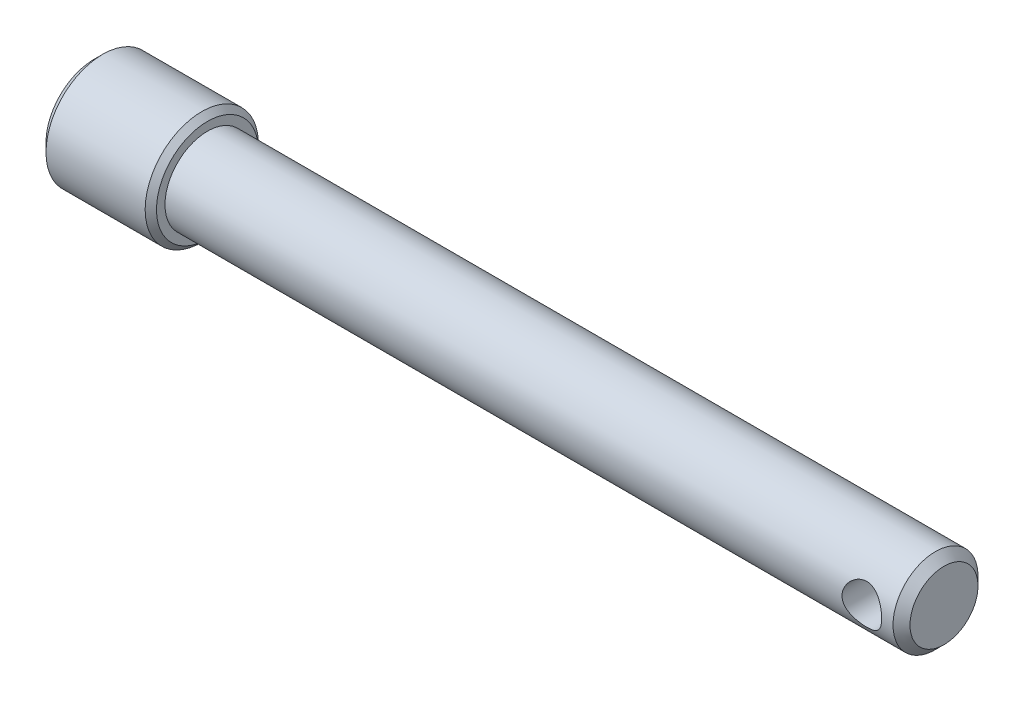
ISO-10303-21;
HEADER;
FILE_DESCRIPTION(('STEP AP214'),'2;1');
FILE_NAME('part.step','',(''),(''),'','','');
FILE_SCHEMA(('AUTOMOTIVE_DESIGN { 1 0 10303 214 1 1 1 1 }'));
ENDSEC;
DATA;
#1=APPLICATION_CONTEXT('core data for automotive mechanical design processes');
#2=APPLICATION_PROTOCOL_DEFINITION('international standard','automotive_design',2000,#1);
#3=PRODUCT_CONTEXT('',#1,'mechanical');
#4=PRODUCT('Part','Part','',(#3));
#5=PRODUCT_RELATED_PRODUCT_CATEGORY('part','',(#4));
#6=PRODUCT_DEFINITION_FORMATION('','',#4);
#7=PRODUCT_DEFINITION_CONTEXT('part definition',#1,'design');
#8=PRODUCT_DEFINITION('design','',#6,#7);
#9=PRODUCT_DEFINITION_SHAPE('','',#8);
#10=(LENGTH_UNIT() NAMED_UNIT(*) SI_UNIT(.MILLI.,.METRE.));
#11=(NAMED_UNIT(*) PLANE_ANGLE_UNIT() SI_UNIT($,.RADIAN.));
#12=(NAMED_UNIT(*) SI_UNIT($,.STERADIAN.) SOLID_ANGLE_UNIT());
#13=UNCERTAINTY_MEASURE_WITH_UNIT(LENGTH_MEASURE(1.E-05),#10,'distance_accuracy_value','');
#14=(GEOMETRIC_REPRESENTATION_CONTEXT(3) GLOBAL_UNCERTAINTY_ASSIGNED_CONTEXT((#13)) GLOBAL_UNIT_ASSIGNED_CONTEXT((#10,
#11,#12)) REPRESENTATION_CONTEXT('',''));
#15=CARTESIAN_POINT('',(0.,0.,0.));
#16=DIRECTION('',(0.,0.,1.));
#17=DIRECTION('',(1.,0.,0.));
#18=AXIS2_PLACEMENT_3D('',#15,#16,#17);
#19=CARTESIAN_POINT('',(0.,0.,0.));
#20=DIRECTION('',(1.,0.,0.));
#21=DIRECTION('',(0.,0.,-1.));
#22=AXIS2_PLACEMENT_3D('',#19,#20,#21);
#23=PLANE('',#22);
#24=CARTESIAN_POINT('',(0.,0.,0.));
#25=DIRECTION('',(1.,0.,0.));
#26=DIRECTION('',(0.,0.,-1.));
#27=AXIS2_PLACEMENT_3D('',#24,#25,#26);
#28=CIRCLE('',#27,17.);
#29=CARTESIAN_POINT('',(0.,0.,-17.));
#30=VERTEX_POINT('',#29);
#31=EDGE_CURVE('E108',#30,#30,#28,.F.);
#32=ORIENTED_EDGE('',*,*,#31,.T.);
#33=EDGE_LOOP('',(#32));
#34=FACE_BOUND('',#33,.T.);
#35=ADVANCED_FACE('F36',(#34),#23,.F.);
#36=CARTESIAN_POINT('',(0.,0.,0.));
#37=DIRECTION('',(-1.,0.,0.));
#38=DIRECTION('',(0.,0.,1.));
#39=AXIS2_PLACEMENT_3D('',#36,#37,#38);
#40=CYLINDRICAL_SURFACE('',#39,20.);
#41=CARTESIAN_POINT('',(38.0000000000001,0.,0.));
#42=DIRECTION('',(-1.,0.,0.));
#43=DIRECTION('',(0.,0.,1.));
#44=AXIS2_PLACEMENT_3D('',#41,#42,#43);
#45=CIRCLE('',#44,20.);
#46=CARTESIAN_POINT('',(38.0000000000001,0.,20.));
#47=VERTEX_POINT('',#46);
#48=EDGE_CURVE('E43',#47,#47,#45,.T.);
#49=ORIENTED_EDGE('',*,*,#48,.T.);
#50=EDGE_LOOP('',(#49));
#51=FACE_BOUND('',#50,.T.);
#52=CARTESIAN_POINT('',(2.99999999999997,0.,0.));
#53=DIRECTION('',(1.,0.,0.));
#54=DIRECTION('',(0.,0.,-1.));
#55=AXIS2_PLACEMENT_3D('',#52,#53,#54);
#56=CIRCLE('',#55,20.);
#57=CARTESIAN_POINT('',(2.99999999999997,0.,-20.));
#58=VERTEX_POINT('',#57);
#59=EDGE_CURVE('E105',#58,#58,#56,.T.);
#60=ORIENTED_EDGE('',*,*,#59,.T.);
#61=EDGE_LOOP('',(#60));
#62=FACE_BOUND('',#61,.T.);
#63=ADVANCED_FACE('F88',(#51,#62),#40,.T.);
#64=CARTESIAN_POINT('',(40.,20.,0.));
#65=DIRECTION('',(-1.,0.,0.));
#66=DIRECTION('',(0.,0.,1.));
#67=AXIS2_PLACEMENT_3D('',#64,#65,#66);
#68=PLANE('',#67);
#69=CARTESIAN_POINT('',(40.,0.,0.));
#70=DIRECTION('',(-1.,0.,0.));
#71=DIRECTION('',(0.,0.,1.));
#72=AXIS2_PLACEMENT_3D('',#69,#70,#71);
#73=CIRCLE('',#72,18.);
#74=CARTESIAN_POINT('',(40.,0.,18.));
#75=VERTEX_POINT('',#74);
#76=EDGE_CURVE('E10',#75,#75,#73,.F.);
#77=ORIENTED_EDGE('',*,*,#76,.T.);
#78=EDGE_LOOP('',(#77));
#79=FACE_BOUND('',#78,.T.);
#80=CARTESIAN_POINT('',(40.,0.,0.));
#81=DIRECTION('',(-1.,0.,0.));
#82=DIRECTION('',(0.,0.,1.));
#83=AXIS2_PLACEMENT_3D('',#80,#81,#82);
#84=CIRCLE('',#83,15.);
#85=CARTESIAN_POINT('',(40.,0.,15.));
#86=VERTEX_POINT('',#85);
#87=EDGE_CURVE('E61',#86,#86,#84,.T.);
#88=ORIENTED_EDGE('',*,*,#87,.T.);
#89=EDGE_LOOP('',(#88));
#90=FACE_BOUND('',#89,.T.);
#91=ADVANCED_FACE('F85',(#79,#90),#68,.F.);
#92=CARTESIAN_POINT('',(0.,0.,0.));
#93=DIRECTION('',(-1.,0.,0.));
#94=DIRECTION('',(0.,0.,1.));
#95=AXIS2_PLACEMENT_3D('',#92,#93,#94);
#96=CYLINDRICAL_SURFACE('',#95,15.);
#97=CARTESIAN_POINT('',(293.,0.,15.));
#98=CARTESIAN_POINT('',(292.999998731185,-0.185527509645677,14.9999989062768));
#99=CARTESIAN_POINT('',(292.992614949632,-0.371089159565341,14.9965492462378));
#100=CARTESIAN_POINT('',(292.963156568287,-0.740864688822055,14.9828363155982));
#101=CARTESIAN_POINT('',(292.941074344481,-0.925077818529062,14.9725695089819));
#102=CARTESIAN_POINT('',(292.882417576453,-1.29101586500657,14.9454673410377));
#103=CARTESIAN_POINT('',(292.845818323161,-1.47273599005481,14.928620781231));
#104=CARTESIAN_POINT('',(292.758512241694,-1.8321376673413,14.8887870557922));
#105=CARTESIAN_POINT('',(292.707799641303,-2.00981753492442,14.8657973778409));
#106=CARTESIAN_POINT('',(292.59302911612,-2.35915888310923,14.8143651145563));
#107=CARTESIAN_POINT('',(292.529027504386,-2.5308422985917,14.7859455779182));
#108=CARTESIAN_POINT('',(292.388115461742,-2.86799253886093,14.7242659158823));
#109=CARTESIAN_POINT('',(292.311200122247,-3.03345697039452,14.6910039504898));
#110=CARTESIAN_POINT('',(292.145151291426,-3.35710712682748,14.6204390462863));
#111=CARTESIAN_POINT('',(292.056025326136,-3.51529725565324,14.5831385995459));
#112=CARTESIAN_POINT('',(291.866159767541,-3.82374236929165,14.5053212671914));
#113=CARTESIAN_POINT('',(291.765415936483,-3.97399442927472,14.4648032096043));
#114=CARTESIAN_POINT('',(291.435167023589,-4.42760170939732,14.3352174768163));
#115=CARTESIAN_POINT('',(291.186620820033,-4.71623752299433,14.2420761526874));
#116=CARTESIAN_POINT('',(290.646248995409,-5.24943713176361,14.0543075209071));
#117=CARTESIAN_POINT('',(290.354395109371,-5.49397191152755,13.9596792791476));
#118=CARTESIAN_POINT('',(289.878587977755,-5.83075411050437,13.8209401738483));
#119=CARTESIAN_POINT('',(289.707857928231,-5.94080662569289,13.7738664925622));
#120=CARTESIAN_POINT('',(289.356748079653,-6.14601851512917,13.6835306533337));
#121=CARTESIAN_POINT('',(289.176372334595,-6.24118408122709,13.640266914032));
#122=CARTESIAN_POINT('',(288.807068494498,-6.41576799436616,13.5590265354511));
#123=CARTESIAN_POINT('',(288.618142634117,-6.49519042717248,13.5210485251475));
#124=CARTESIAN_POINT('',(288.232961945148,-6.63747055086571,13.451775124541));
#125=CARTESIAN_POINT('',(288.036707820823,-6.70032982886077,13.4204790940145));
#126=CARTESIAN_POINT('',(287.649493283325,-6.8056708258586,13.3673531698136));
#127=CARTESIAN_POINT('',(287.458848094664,-6.84909352838975,13.3450926725969));
#128=CARTESIAN_POINT('',(287.07384521852,-6.9199102330319,13.308509999873));
#129=CARTESIAN_POINT('',(286.879487671313,-6.94730483955541,13.2941875250276));
#130=CARTESIAN_POINT('',(286.488847201393,-6.98566539986721,13.2740706095154));
#131=CARTESIAN_POINT('',(286.29256565297,-6.99664232637608,13.268270473008));
#132=CARTESIAN_POINT('',(285.899718519804,-7.00203713984637,13.2654245810255));
#133=CARTESIAN_POINT('',(285.703152957552,-6.99645627313708,13.2683781666449));
#134=CARTESIAN_POINT('',(285.331339752467,-6.97022504829947,13.2821739666281));
#135=CARTESIAN_POINT('',(285.15594684776,-6.95115599863703,13.2921880639042));
#136=CARTESIAN_POINT('',(284.80753469159,-6.89993033282356,13.3188511388526));
#137=CARTESIAN_POINT('',(284.634516258478,-6.86776931614205,13.3355023473812));
#138=CARTESIAN_POINT('',(284.29208944034,-6.79071696417095,13.3749029758743));
#139=CARTESIAN_POINT('',(284.122680397831,-6.7458279690808,13.3976512747697));
#140=CARTESIAN_POINT('',(283.788387619747,-6.64374391554766,13.4485656794008));
#141=CARTESIAN_POINT('',(283.623505676398,-6.58654406038235,13.476733896463));
#142=CARTESIAN_POINT('',(283.295528755006,-6.45890740188147,13.5383766583609));
#143=CARTESIAN_POINT('',(283.132558707799,-6.38820027843811,13.5719568830626));
#144=CARTESIAN_POINT('',(282.813133687563,-6.23500689962573,13.6430140070596));
#145=CARTESIAN_POINT('',(282.656680917411,-6.15251670257496,13.6804922091636));
#146=CARTESIAN_POINT('',(282.198106905428,-5.88811674282604,13.7973596666347));
#147=CARTESIAN_POINT('',(281.906608427055,-5.68921430581532,13.8812136856748));
#148=CARTESIAN_POINT('',(281.480083195142,-5.34868196260137,14.0145878791314));
#149=CARTESIAN_POINT('',(281.333169460297,-5.22097547055307,14.062774006816));
#150=CARTESIAN_POINT('',(281.050461861807,-4.95377039757655,14.1591066274215));
#151=CARTESIAN_POINT('',(280.914665038339,-4.81427497562731,14.2072531274913));
#152=CARTESIAN_POINT('',(280.65487840278,-4.52411760657536,14.3022965716615));
#153=CARTESIAN_POINT('',(280.530897271043,-4.37344759241105,14.3491925791524));
#154=CARTESIAN_POINT('',(280.295666536213,-4.06185463446135,14.4404874529307));
#155=CARTESIAN_POINT('',(280.184411881194,-3.90093579883465,14.4848873065116));
#156=CARTESIAN_POINT('',(279.971598456267,-3.56364449353819,14.5716107423194));
#157=CARTESIAN_POINT('',(279.870536561455,-3.38692345719508,14.6138009529048));
#158=CARTESIAN_POINT('',(279.683840629405,-3.02450952652822,14.6930843662266));
#159=CARTESIAN_POINT('',(279.59819975633,-2.83882065399379,14.7301798256273));
#160=CARTESIAN_POINT('',(279.443200637618,-2.45973540135431,14.7982015015905));
#161=CARTESIAN_POINT('',(279.373837196788,-2.26634150354194,14.8291296860587));
#162=CARTESIAN_POINT('',(279.252176543608,-1.87328306037451,14.8838894885933));
#163=CARTESIAN_POINT('',(279.199877652853,-1.67361913383426,14.9077218045617));
#164=CARTESIAN_POINT('',(279.116286369063,-1.2849064291877,14.9460444220633));
#165=CARTESIAN_POINT('',(279.083709623586,-1.09618911448908,14.9611026527104));
#166=CARTESIAN_POINT('',(279.034110660614,-0.716291599582736,14.9840958549318));
#167=CARTESIAN_POINT('',(279.017087669268,-0.525111522385641,14.9920311808939));
#168=CARTESIAN_POINT('',(278.998810769293,-0.1418993641754,15.0005528438796));
#169=CARTESIAN_POINT('',(278.9975516513,0.0501324143963466,15.0011416086632));
#170=CARTESIAN_POINT('',(279.010805394318,0.433528042251175,14.9949593473442));
#171=CARTESIAN_POINT('',(279.025317720246,0.624891913973539,14.9881885709307));
#172=CARTESIAN_POINT('',(279.068460602576,0.992870834443823,14.9681629903725));
#173=CARTESIAN_POINT('',(279.096099879654,1.16962816611798,14.9553639048463));
#174=CARTESIAN_POINT('',(279.164701446072,1.52005950944229,14.9238191531151));
#175=CARTESIAN_POINT('',(279.205668308818,1.69373244106442,14.9050714456742));
#176=CARTESIAN_POINT('',(279.300501872521,2.03675771838471,14.8620823178559));
#177=CARTESIAN_POINT('',(279.354364599359,2.20611137739661,14.8378425900775));
#178=CARTESIAN_POINT('',(279.474524787604,2.53960724339977,14.7844151696283));
#179=CARTESIAN_POINT('',(279.540827001896,2.70374743030252,14.7552255861255));
#180=CARTESIAN_POINT('',(279.687496555851,3.03073676035295,14.6916030220054));
#181=CARTESIAN_POINT('',(279.768228531778,3.19339683288598,14.6570381953359));
#182=CARTESIAN_POINT('',(279.941676488434,3.5113451762473,14.584138843629));
#183=CARTESIAN_POINT('',(280.034396861914,3.6666307162628,14.5458029380419));
#184=CARTESIAN_POINT('',(280.329573046536,4.12023182505412,14.4264075499976));
#185=CARTESIAN_POINT('',(280.549122772008,4.4064664376566,14.3409250342679));
#186=CARTESIAN_POINT('',(281.049825709392,4.9647193083283,14.1578733053259));
#187=CARTESIAN_POINT('',(281.334695542914,5.23328196853217,14.0599018903553));
#188=CARTESIAN_POINT('',(281.793075524838,5.59821974218258,13.9167925594408));
#189=CARTESIAN_POINT('',(281.951180598419,5.7136215184732,13.8696962817171));
#190=CARTESIAN_POINT('',(282.277006240607,5.93107342051141,13.7781079674164));
#191=CARTESIAN_POINT('',(282.444723051885,6.03312871302397,13.733614926768));
#192=CARTESIAN_POINT('',(282.794602072578,6.22628880730177,13.6471574298561));
#193=CARTESIAN_POINT('',(282.977058470485,6.31692040134293,13.605325087148));
#194=CARTESIAN_POINT('',(283.350124183828,6.48226486106475,13.5273278724206));
#195=CARTESIAN_POINT('',(283.540729569121,6.55698529876342,13.4911603067471));
#196=CARTESIAN_POINT('',(283.928721934361,6.68967957746412,13.4258579093784));
#197=CARTESIAN_POINT('',(284.126104294965,6.74766458174978,13.3967183918025));
#198=CARTESIAN_POINT('',(284.526190836834,6.84618962224932,13.3466383139004));
#199=CARTESIAN_POINT('',(284.728894325902,6.88673191567378,13.3256966927399));
#200=CARTESIAN_POINT('',(285.119365190303,6.94693568439706,13.2944019582038));
#201=CARTESIAN_POINT('',(285.306831370662,6.96815027183318,13.2832643862308));
#202=CARTESIAN_POINT('',(285.683165511346,6.99536983244682,13.2689503293364));
#203=CARTESIAN_POINT('',(285.872033382705,7.00137576279052,13.2657733434108));
#204=CARTESIAN_POINT('',(286.249550262692,6.99809627788962,13.2675035477491));
#205=CARTESIAN_POINT('',(286.438199313326,6.98881457498722,13.2724087753849));
#206=CARTESIAN_POINT('',(286.8137582576,6.95509456989443,13.290109888523));
#207=CARTESIAN_POINT('',(287.000668192646,6.93065662949753,13.3029055856724));
#208=CARTESIAN_POINT('',(287.35768209921,6.8692843881236,13.3346925888752));
#209=CARTESIAN_POINT('',(287.528014314427,6.83339644144752,13.3531614744204));
#210=CARTESIAN_POINT('',(287.864907271624,6.74924259205049,13.3958930302163));
#211=CARTESIAN_POINT('',(288.03146671653,6.70097250059887,13.4201576609062));
#212=CARTESIAN_POINT('',(288.359782252653,6.59251960987346,13.4737648408456));
#213=CARTESIAN_POINT('',(288.521539054633,6.53233858355505,13.5031066342723));
#214=CARTESIAN_POINT('',(288.839518895929,6.40052875735875,13.566081427855));
#215=CARTESIAN_POINT('',(288.995739773988,6.32889554534482,13.5997160808918));
#216=CARTESIAN_POINT('',(289.311968424198,6.16962215490878,13.6727441336945));
#217=CARTESIAN_POINT('',(289.471547811653,6.0812384009807,13.7123709267442));
#218=CARTESIAN_POINT('',(289.782850185486,5.89263773440723,13.7944698641418));
#219=CARTESIAN_POINT('',(289.934570457495,5.79241677212962,13.8369429800842));
#220=CARTESIAN_POINT('',(290.229466126266,5.58073172162977,13.9236674839918));
#221=CARTESIAN_POINT('',(290.372639600568,5.46926511894058,13.9679192683215));
#222=CARTESIAN_POINT('',(290.64978444755,5.2356806677691,14.0571433668396));
#223=CARTESIAN_POINT('',(290.783755243666,5.11356215301158,14.1021157259559));
#224=CARTESIAN_POINT('',(291.054880467189,4.84643680575926,14.1962694508257));
#225=CARTESIAN_POINT('',(291.190997728087,4.70036340605841,14.2454187789171));
#226=CARTESIAN_POINT('',(291.450467691077,4.39684571191632,14.3420047892902));
#227=CARTESIAN_POINT('',(291.573824378744,4.23940499413342,14.3894420032928));
#228=CARTESIAN_POINT('',(291.80708707106,3.91380631181854,14.4813935477573));
#229=CARTESIAN_POINT('',(291.916980429089,3.74563849295402,14.525905112131));
#230=CARTESIAN_POINT('',(292.122258744005,3.39976003653134,14.6107261253301));
#231=CARTESIAN_POINT('',(292.21765040113,3.2220538576611,14.6510375120433));
#232=CARTESIAN_POINT('',(292.392689257187,2.8590097550195,14.7261758713317));
#233=CARTESIAN_POINT('',(292.472409508319,2.67371235445625,14.7610281291556));
#234=CARTESIAN_POINT('',(292.615804406194,2.29606194070378,14.8244639822681));
#235=CARTESIAN_POINT('',(292.679486854492,2.1037124103785,14.853050624571));
#236=CARTESIAN_POINT('',(292.78997978571,1.71380885804306,14.9030669239484));
#237=CARTESIAN_POINT('',(292.836829327729,1.51626804103596,14.9245131410752));
#238=CARTESIAN_POINT('',(292.913238372601,1.11729196078999,14.9596693268297));
#239=CARTESIAN_POINT('',(292.942809325723,0.915859368227754,14.9733844185492));
#240=CARTESIAN_POINT('',(292.975685503433,0.594975071491539,14.9886652615981));
#241=CARTESIAN_POINT('',(292.984798531042,0.476212067355962,14.9929110778711));
#242=CARTESIAN_POINT('',(292.996956247323,0.238304074964917,14.9985788264754));
#243=CARTESIAN_POINT('',(293.000000814924,0.119159079135994,15.0000007024675));
#244=CARTESIAN_POINT('',(293.,0.,15.));
#245=B_SPLINE_CURVE_WITH_KNOTS('',3,(#97,#98,#99,#100,#101,#102,#103,#104,#105,#106,#107,#108,
#109,#110,#111,#112,#113,#114,#115,#116,#117,#118,#119,#120,#121,#122,#123,#124,#125,#126,#127,
#128,#129,#130,#131,#132,#133,#134,#135,#136,#137,#138,#139,#140,#141,#142,#143,#144,#145,#146,
#147,#148,#149,#150,#151,#152,#153,#154,#155,#156,#157,#158,#159,#160,#161,#162,#163,#164,#165,
#166,#167,#168,#169,#170,#171,#172,#173,#174,#175,#176,#177,#178,#179,#180,#181,#182,#183,#184,
#185,#186,#187,#188,#189,#190,#191,#192,#193,#194,#195,#196,#197,#198,#199,#200,#201,#202,#203,
#204,#205,#206,#207,#208,#209,#210,#211,#212,#213,#214,#215,#216,#217,#218,#219,#220,#221,#222,
#223,#224,#225,#226,#227,#228,#229,#230,#231,#232,#233,#234,#235,#236,#237,#238,#239,#240,#241,
#242,#243,#244),.UNSPECIFIED.,.T.,.F.,(4,2,2,2,2,2,2,2,2,2,2,2,2,2,2,2,2,2,2,2,2,2,2,2,2,2,2,2,
2,2,2,2,2,2,2,2,2,2,2,2,2,2,2,2,2,2,2,2,2,2,2,2,2,2,2,2,2,2,2,2,2,2,2,2,2,2,2,2,2,2,2,2,2,4),
(0.,0.55646389738204,1.11321665517296,1.67092114244937,2.22885406123899,2.78446926592942,
3.34029614341329,3.89578196472596,4.4514710508195,5.62255040167626,6.7943974524586,
7.41925763509554,8.04385722793117,8.6682945075784,9.29267193086307,9.88222605810047,
10.4717579520757,11.0608956573529,11.6499890184991,12.1794981405363,12.7091853907005,
13.2387753142616,13.7685719585179,14.3103609351528,14.8523315777009,15.9357488970923,
16.5368462109868,17.137782961594,17.7391578388527,18.3402931586924,18.9631926758348,
19.5858153904363,20.2082391143216,20.8306016005376,21.4061427166912,21.9816551962003,
22.5569774856049,23.132280256506,23.6697472508524,24.2073988737646,24.7448850213767,
25.282576951723,25.8365253406995,26.390677284073,27.498403260955,28.7034024399017,
29.3068236619324,29.9100105882888,30.5331266643461,31.1559455374182,31.7783479971204,
32.4006698892832,32.9668805427282,33.5330555604721,34.0990931124934,34.6651171531916,
35.1896844187629,35.7144293736938,36.2390962784422,36.7639658087169,37.3234087254227,
37.8830435907858,38.4428038661048,39.0025991794737,39.6187477336262,40.2347032581719,
40.8512330078131,41.4674770300147,42.0807765176618,42.693777088281,43.3053459226825,
43.916509018283,44.2739029318525,44.6313039755635),.UNSPECIFIED.);
#246=CARTESIAN_POINT('',(293.,0.,15.));
#247=VERTEX_POINT('',#246);
#248=EDGE_CURVE('E54',#247,#247,#245,.T.);
#249=ORIENTED_EDGE('',*,*,#248,.T.);
#250=EDGE_LOOP('',(#249));
#251=FACE_BOUND('',#250,.T.);
#252=CARTESIAN_POINT('',(293.,0.,-15.));
#253=CARTESIAN_POINT('',(292.999998731185,0.185527509645679,-14.9999989062768));
#254=CARTESIAN_POINT('',(292.992614949632,0.371089159565344,-14.9965492462378));
#255=CARTESIAN_POINT('',(292.963156568287,0.740864688822061,-14.9828363155982));
#256=CARTESIAN_POINT('',(292.941074344481,0.925077818529069,-14.9725695089819));
#257=CARTESIAN_POINT('',(292.882417576453,1.29101586500658,-14.9454673410377));
#258=CARTESIAN_POINT('',(292.845818323161,1.47273599005481,-14.928620781231));
#259=CARTESIAN_POINT('',(292.758512241694,1.8321376673413,-14.8887870557922));
#260=CARTESIAN_POINT('',(292.707799641303,2.00981753492442,-14.8657973778409));
#261=CARTESIAN_POINT('',(292.59302911612,2.35915888310923,-14.8143651145563));
#262=CARTESIAN_POINT('',(292.529027504386,2.5308422985917,-14.7859455779182));
#263=CARTESIAN_POINT('',(292.388115461742,2.86799253886093,-14.7242659158823));
#264=CARTESIAN_POINT('',(292.311200122247,3.03345697039452,-14.6910039504898));
#265=CARTESIAN_POINT('',(292.145151291426,3.35710712682748,-14.6204390462863));
#266=CARTESIAN_POINT('',(292.056025326136,3.51529725565324,-14.5831385995459));
#267=CARTESIAN_POINT('',(291.866159767541,3.82374236929164,-14.5053212671914));
#268=CARTESIAN_POINT('',(291.765415936483,3.97399442927472,-14.4648032096043));
#269=CARTESIAN_POINT('',(291.435167023589,4.42760170939731,-14.3352174768163));
#270=CARTESIAN_POINT('',(291.186620820033,4.71623752299432,-14.2420761526874));
#271=CARTESIAN_POINT('',(290.646248995409,5.2494371317636,-14.0543075209071));
#272=CARTESIAN_POINT('',(290.354395109371,5.49397191152755,-13.9596792791476));
#273=CARTESIAN_POINT('',(289.878587977755,5.83075411050437,-13.8209401738483));
#274=CARTESIAN_POINT('',(289.707857928231,5.94080662569289,-13.7738664925622));
#275=CARTESIAN_POINT('',(289.356748079653,6.14601851512917,-13.6835306533337));
#276=CARTESIAN_POINT('',(289.176372334595,6.24118408122709,-13.640266914032));
#277=CARTESIAN_POINT('',(288.807068494498,6.41576799436616,-13.5590265354511));
#278=CARTESIAN_POINT('',(288.618142634117,6.49519042717248,-13.5210485251475));
#279=CARTESIAN_POINT('',(288.232961945148,6.63747055086571,-13.451775124541));
#280=CARTESIAN_POINT('',(288.036707820823,6.70032982886077,-13.4204790940145));
#281=CARTESIAN_POINT('',(287.649493283325,6.8056708258586,-13.3673531698136));
#282=CARTESIAN_POINT('',(287.458848094664,6.84909352838975,-13.3450926725969));
#283=CARTESIAN_POINT('',(287.07384521852,6.9199102330319,-13.308509999873));
#284=CARTESIAN_POINT('',(286.879487671313,6.94730483955541,-13.2941875250276));
#285=CARTESIAN_POINT('',(286.488847201393,6.98566539986721,-13.2740706095154));
#286=CARTESIAN_POINT('',(286.29256565297,6.99664232637608,-13.268270473008));
#287=CARTESIAN_POINT('',(285.899718519804,7.00203713984637,-13.2654245810255));
#288=CARTESIAN_POINT('',(285.703152957552,6.99645627313708,-13.2683781666449));
#289=CARTESIAN_POINT('',(285.331339752467,6.97022504829947,-13.2821739666281));
#290=CARTESIAN_POINT('',(285.15594684776,6.95115599863703,-13.2921880639042));
#291=CARTESIAN_POINT('',(284.80753469159,6.89993033282356,-13.3188511388526));
#292=CARTESIAN_POINT('',(284.634516258478,6.86776931614205,-13.3355023473812));
#293=CARTESIAN_POINT('',(284.29208944034,6.79071696417095,-13.3749029758743));
#294=CARTESIAN_POINT('',(284.122680397831,6.7458279690808,-13.3976512747697));
#295=CARTESIAN_POINT('',(283.788387619747,6.64374391554766,-13.4485656794008));
#296=CARTESIAN_POINT('',(283.623505676398,6.58654406038235,-13.476733896463));
#297=CARTESIAN_POINT('',(283.295528755006,6.45890740188147,-13.5383766583609));
#298=CARTESIAN_POINT('',(283.132558707799,6.38820027843811,-13.5719568830626));
#299=CARTESIAN_POINT('',(282.813133687563,6.23500689962573,-13.6430140070596));
#300=CARTESIAN_POINT('',(282.656680917411,6.15251670257496,-13.6804922091636));
#301=CARTESIAN_POINT('',(282.198106905428,5.88811674282604,-13.7973596666347));
#302=CARTESIAN_POINT('',(281.906608427055,5.68921430581532,-13.8812136856748));
#303=CARTESIAN_POINT('',(281.480083195142,5.34868196260137,-14.0145878791314));
#304=CARTESIAN_POINT('',(281.333169460297,5.22097547055307,-14.062774006816));
#305=CARTESIAN_POINT('',(281.050461861807,4.95377039757655,-14.1591066274215));
#306=CARTESIAN_POINT('',(280.914665038339,4.81427497562731,-14.2072531274913));
#307=CARTESIAN_POINT('',(280.65487840278,4.52411760657536,-14.3022965716615));
#308=CARTESIAN_POINT('',(280.530897271043,4.37344759241106,-14.3491925791524));
#309=CARTESIAN_POINT('',(280.295666536213,4.06185463446136,-14.4404874529307));
#310=CARTESIAN_POINT('',(280.184411881194,3.90093579883465,-14.4848873065116));
#311=CARTESIAN_POINT('',(279.971598456267,3.56364449353819,-14.5716107423194));
#312=CARTESIAN_POINT('',(279.870536561455,3.38692345719508,-14.6138009529048));
#313=CARTESIAN_POINT('',(279.683840629405,3.02450952652822,-14.6930843662266));
#314=CARTESIAN_POINT('',(279.59819975633,2.83882065399379,-14.7301798256273));
#315=CARTESIAN_POINT('',(279.443200637618,2.45973540135431,-14.7982015015905));
#316=CARTESIAN_POINT('',(279.373837196788,2.26634150354194,-14.8291296860587));
#317=CARTESIAN_POINT('',(279.252176543608,1.87328306037451,-14.8838894885933));
#318=CARTESIAN_POINT('',(279.199877652853,1.67361913383426,-14.9077218045617));
#319=CARTESIAN_POINT('',(279.116286369063,1.28490642918769,-14.9460444220633));
#320=CARTESIAN_POINT('',(279.083709623586,1.09618911448906,-14.9611026527104));
#321=CARTESIAN_POINT('',(279.034110660614,0.716291599582722,-14.9840958549318));
#322=CARTESIAN_POINT('',(279.017087669268,0.525111522385633,-14.9920311808939));
#323=CARTESIAN_POINT('',(278.998810769293,0.141899364175397,-15.0005528438796));
#324=CARTESIAN_POINT('',(278.9975516513,-0.0501324143963491,-15.0011416086632));
#325=CARTESIAN_POINT('',(279.010805394318,-0.433528042251178,-14.9949593473442));
#326=CARTESIAN_POINT('',(279.025317720246,-0.624891913973542,-14.9881885709307));
#327=CARTESIAN_POINT('',(279.068460602576,-0.992870834443826,-14.9681629903725));
#328=CARTESIAN_POINT('',(279.096099879654,-1.16962816611799,-14.9553639048463));
#329=CARTESIAN_POINT('',(279.164701446072,-1.52005950944229,-14.9238191531151));
#330=CARTESIAN_POINT('',(279.205668308818,-1.69373244106442,-14.9050714456742));
#331=CARTESIAN_POINT('',(279.300501872521,-2.03675771838471,-14.8620823178559));
#332=CARTESIAN_POINT('',(279.354364599359,-2.20611137739661,-14.8378425900775));
#333=CARTESIAN_POINT('',(279.474524787604,-2.53960724339977,-14.7844151696283));
#334=CARTESIAN_POINT('',(279.540827001896,-2.70374743030252,-14.7552255861255));
#335=CARTESIAN_POINT('',(279.687496555851,-3.03073676035295,-14.6916030220054));
#336=CARTESIAN_POINT('',(279.768228531778,-3.19339683288599,-14.6570381953359));
#337=CARTESIAN_POINT('',(279.941676488434,-3.5113451762473,-14.584138843629));
#338=CARTESIAN_POINT('',(280.034396861914,-3.6666307162628,-14.5458029380419));
#339=CARTESIAN_POINT('',(280.329573046536,-4.12023182505412,-14.4264075499976));
#340=CARTESIAN_POINT('',(280.549122772008,-4.4064664376566,-14.3409250342679));
#341=CARTESIAN_POINT('',(281.049825709392,-4.9647193083283,-14.1578733053259));
#342=CARTESIAN_POINT('',(281.334695542914,-5.23328196853217,-14.0599018903553));
#343=CARTESIAN_POINT('',(281.793075524838,-5.59821974218258,-13.9167925594408));
#344=CARTESIAN_POINT('',(281.951180598419,-5.7136215184732,-13.8696962817171));
#345=CARTESIAN_POINT('',(282.277006240607,-5.93107342051141,-13.7781079674164));
#346=CARTESIAN_POINT('',(282.444723051885,-6.03312871302397,-13.733614926768));
#347=CARTESIAN_POINT('',(282.794602072578,-6.22628880730177,-13.6471574298561));
#348=CARTESIAN_POINT('',(282.977058470485,-6.31692040134292,-13.605325087148));
#349=CARTESIAN_POINT('',(283.350124183828,-6.48226486106475,-13.5273278724206));
#350=CARTESIAN_POINT('',(283.540729569121,-6.5569852987634,-13.4911603067471));
#351=CARTESIAN_POINT('',(283.928721934361,-6.68967957746411,-13.4258579093784));
#352=CARTESIAN_POINT('',(284.126104294965,-6.74766458174977,-13.3967183918025));
#353=CARTESIAN_POINT('',(284.526190836834,-6.84618962224931,-13.3466383139004));
#354=CARTESIAN_POINT('',(284.728894325902,-6.88673191567377,-13.3256966927399));
#355=CARTESIAN_POINT('',(285.119365190303,-6.94693568439705,-13.2944019582038));
#356=CARTESIAN_POINT('',(285.306831370662,-6.96815027183317,-13.2832643862308));
#357=CARTESIAN_POINT('',(285.683165511346,-6.99536983244682,-13.2689503293364));
#358=CARTESIAN_POINT('',(285.872033382704,-7.00137576279052,-13.2657733434108));
#359=CARTESIAN_POINT('',(286.249550262692,-6.99809627788962,-13.2675035477491));
#360=CARTESIAN_POINT('',(286.438199313326,-6.98881457498722,-13.2724087753849));
#361=CARTESIAN_POINT('',(286.8137582576,-6.95509456989443,-13.290109888523));
#362=CARTESIAN_POINT('',(287.000668192646,-6.93065662949753,-13.3029055856724));
#363=CARTESIAN_POINT('',(287.35768209921,-6.8692843881236,-13.3346925888752));
#364=CARTESIAN_POINT('',(287.528014314427,-6.83339644144752,-13.3531614744204));
#365=CARTESIAN_POINT('',(287.864907271624,-6.74924259205049,-13.3958930302163));
#366=CARTESIAN_POINT('',(288.03146671653,-6.70097250059887,-13.4201576609062));
#367=CARTESIAN_POINT('',(288.359782252653,-6.59251960987345,-13.4737648408456));
#368=CARTESIAN_POINT('',(288.521539054633,-6.53233858355505,-13.5031066342724));
#369=CARTESIAN_POINT('',(288.839518895929,-6.40052875735875,-13.566081427855));
#370=CARTESIAN_POINT('',(288.995739773988,-6.32889554534482,-13.5997160808918));
#371=CARTESIAN_POINT('',(289.311968424198,-6.16962215490878,-13.6727441336945));
#372=CARTESIAN_POINT('',(289.471547811653,-6.0812384009807,-13.7123709267442));
#373=CARTESIAN_POINT('',(289.782850185486,-5.89263773440723,-13.7944698641418));
#374=CARTESIAN_POINT('',(289.934570457495,-5.79241677212962,-13.8369429800842));
#375=CARTESIAN_POINT('',(290.229466126266,-5.58073172162977,-13.9236674839918));
#376=CARTESIAN_POINT('',(290.372639600568,-5.46926511894058,-13.9679192683215));
#377=CARTESIAN_POINT('',(290.64978444755,-5.2356806677691,-14.0571433668396));
#378=CARTESIAN_POINT('',(290.783755243666,-5.11356215301158,-14.1021157259559));
#379=CARTESIAN_POINT('',(291.054880467189,-4.84643680575926,-14.1962694508257));
#380=CARTESIAN_POINT('',(291.190997728087,-4.70036340605841,-14.2454187789171));
#381=CARTESIAN_POINT('',(291.450467691077,-4.39684571191632,-14.3420047892902));
#382=CARTESIAN_POINT('',(291.573824378744,-4.23940499413342,-14.3894420032928));
#383=CARTESIAN_POINT('',(291.80708707106,-3.91380631181854,-14.4813935477573));
#384=CARTESIAN_POINT('',(291.916980429089,-3.74563849295402,-14.525905112131));
#385=CARTESIAN_POINT('',(292.122258744005,-3.39976003653134,-14.6107261253301));
#386=CARTESIAN_POINT('',(292.21765040113,-3.2220538576611,-14.6510375120433));
#387=CARTESIAN_POINT('',(292.392689257187,-2.8590097550195,-14.7261758713317));
#388=CARTESIAN_POINT('',(292.472409508319,-2.67371235445624,-14.7610281291556));
#389=CARTESIAN_POINT('',(292.615804406194,-2.29606194070376,-14.8244639822681));
#390=CARTESIAN_POINT('',(292.679486854492,-2.10371241037847,-14.853050624571));
#391=CARTESIAN_POINT('',(292.78997978571,-1.71380885804304,-14.9030669239484));
#392=CARTESIAN_POINT('',(292.836829327729,-1.51626804103594,-14.9245131410752));
#393=CARTESIAN_POINT('',(292.913238372601,-1.11729196078999,-14.9596693268297));
#394=CARTESIAN_POINT('',(292.942809325723,-0.915859368227752,-14.9733844185492));
#395=CARTESIAN_POINT('',(292.975685503433,-0.59497507149154,-14.9886652615981));
#396=CARTESIAN_POINT('',(292.984798531042,-0.476212067355964,-14.9929110778711));
#397=CARTESIAN_POINT('',(292.996956247323,-0.238304074964919,-14.9985788264754));
#398=CARTESIAN_POINT('',(293.000000814924,-0.119159079135995,-15.0000007024675));
#399=CARTESIAN_POINT('',(293.,0.,-15.));
#400=B_SPLINE_CURVE_WITH_KNOTS('',3,(#252,#253,#254,#255,#256,#257,#258,#259,#260,#261,#262,
#263,#264,#265,#266,#267,#268,#269,#270,#271,#272,#273,#274,#275,#276,#277,#278,#279,#280,#281,
#282,#283,#284,#285,#286,#287,#288,#289,#290,#291,#292,#293,#294,#295,#296,#297,#298,#299,#300,
#301,#302,#303,#304,#305,#306,#307,#308,#309,#310,#311,#312,#313,#314,#315,#316,#317,#318,#319,
#320,#321,#322,#323,#324,#325,#326,#327,#328,#329,#330,#331,#332,#333,#334,#335,#336,#337,#338,
#339,#340,#341,#342,#343,#344,#345,#346,#347,#348,#349,#350,#351,#352,#353,#354,#355,#356,#357,
#358,#359,#360,#361,#362,#363,#364,#365,#366,#367,#368,#369,#370,#371,#372,#373,#374,#375,#376,
#377,#378,#379,#380,#381,#382,#383,#384,#385,#386,#387,#388,#389,#390,#391,#392,#393,#394,#395,
#396,#397,#398,#399),.UNSPECIFIED.,.T.,.F.,(4,2,2,2,2,2,2,2,2,2,2,2,2,2,2,2,2,2,2,2,2,2,2,2,2,2,
2,2,2,2,2,2,2,2,2,2,2,2,2,2,2,2,2,2,2,2,2,2,2,2,2,2,2,2,2,2,2,2,2,2,2,2,2,2,2,2,2,2,2,2,2,2,2,
4),(0.,0.556463897382043,1.11321665517297,1.67092114244937,2.22885406123898,2.78446926592941,
3.34029614341329,3.89578196472596,4.4514710508195,5.62255040167626,6.7943974524586,
7.41925763509553,8.04385722793117,8.6682945075784,9.29267193086307,9.88222605810046,
10.4717579520757,11.0608956573529,11.6499890184991,12.1794981405363,12.7091853907005,
13.2387753142616,13.7685719585179,14.3103609351528,14.8523315777009,15.9357488970923,
16.5368462109868,17.137782961594,17.7391578388527,18.3402931586924,18.9631926758348,
19.5858153904363,20.2082391143216,20.8306016005376,21.4061427166912,21.9816551962003,
22.556977485605,23.132280256506,23.6697472508524,24.2073988737646,24.7448850213767,
25.2825769517231,25.8365253406995,26.390677284073,27.498403260955,28.7034024399017,
29.3068236619324,29.9100105882888,30.5331266643461,31.1559455374182,31.7783479971204,
32.4006698892832,32.9668805427281,33.533055560472,34.0990931124934,34.6651171531916,
35.1896844187629,35.7144293736938,36.2390962784422,36.7639658087169,37.3234087254227,
37.8830435907858,38.4428038661048,39.0025991794737,39.6187477336262,40.2347032581719,
40.8512330078131,41.4674770300147,42.0807765176618,42.693777088281,43.3053459226825,
43.916509018283,44.2739029318525,44.6313039755635),.UNSPECIFIED.);
#401=CARTESIAN_POINT('',(293.,0.,-15.));
#402=VERTEX_POINT('',#401);
#403=EDGE_CURVE('E62',#402,#402,#400,.T.);
#404=ORIENTED_EDGE('',*,*,#403,.T.);
#405=EDGE_LOOP('',(#404));
#406=FACE_BOUND('',#405,.T.);
#407=CARTESIAN_POINT('',(297.,0.,0.));
#408=DIRECTION('',(-1.,0.,0.));
#409=DIRECTION('',(0.,0.,1.));
#410=AXIS2_PLACEMENT_3D('',#407,#408,#409);
#411=CIRCLE('',#410,15.);
#412=CARTESIAN_POINT('',(297.,0.,15.));
#413=VERTEX_POINT('',#412);
#414=EDGE_CURVE('E51',#413,#413,#411,.T.);
#415=ORIENTED_EDGE('',*,*,#414,.T.);
#416=EDGE_LOOP('',(#415));
#417=FACE_BOUND('',#416,.T.);
#418=ORIENTED_EDGE('',*,*,#87,.F.);
#419=EDGE_LOOP('',(#418));
#420=FACE_BOUND('',#419,.T.);
#421=ADVANCED_FACE('F65',(#251,#406,#417,#420),#96,.T.);
#422=CARTESIAN_POINT('',(300.,15.,0.));
#423=DIRECTION('',(-1.,0.,0.));
#424=DIRECTION('',(0.,0.,1.));
#425=AXIS2_PLACEMENT_3D('',#422,#423,#424);
#426=PLANE('',#425);
#427=CARTESIAN_POINT('',(300.,0.,0.));
#428=DIRECTION('',(-1.,0.,0.));
#429=DIRECTION('',(0.,0.,1.));
#430=AXIS2_PLACEMENT_3D('',#427,#428,#429);
#431=CIRCLE('',#430,12.);
#432=CARTESIAN_POINT('',(300.,0.,12.));
#433=VERTEX_POINT('',#432);
#434=EDGE_CURVE('E47',#433,#433,#431,.F.);
#435=ORIENTED_EDGE('',*,*,#434,.T.);
#436=EDGE_LOOP('',(#435));
#437=FACE_BOUND('',#436,.T.);
#438=ADVANCED_FACE('F74',(#437),#426,.F.);
#439=CARTESIAN_POINT('',(0.,0.,0.));
#440=DIRECTION('',(1.,0.,0.));
#441=DIRECTION('',(0.,0.,-1.));
#442=AXIS2_PLACEMENT_3D('',#439,#440,#441);
#443=CONICAL_SURFACE('',#442,17.,0.785398163397446);
#444=ORIENTED_EDGE('',*,*,#59,.F.);
#445=EDGE_LOOP('',(#444));
#446=FACE_BOUND('',#445,.T.);
#447=ORIENTED_EDGE('',*,*,#31,.F.);
#448=EDGE_LOOP('',(#447));
#449=FACE_BOUND('',#448,.T.);
#450=ADVANCED_FACE('F77',(#446,#449),#443,.T.);
#451=CARTESIAN_POINT('',(297.,0.,0.));
#452=DIRECTION('',(-1.,0.,0.));
#453=DIRECTION('',(0.,0.,1.));
#454=AXIS2_PLACEMENT_3D('',#451,#452,#453);
#455=CONICAL_SURFACE('',#454,15.,0.785398163397446);
#456=ORIENTED_EDGE('',*,*,#434,.F.);
#457=EDGE_LOOP('',(#456));
#458=FACE_BOUND('',#457,.T.);
#459=ORIENTED_EDGE('',*,*,#414,.F.);
#460=EDGE_LOOP('',(#459));
#461=FACE_BOUND('',#460,.T.);
#462=ADVANCED_FACE('F72',(#458,#461),#455,.T.);
#463=CARTESIAN_POINT('',(286.,0.,-45.));
#464=DIRECTION('',(0.,0.,1.));
#465=DIRECTION('',(1.,0.,0.));
#466=AXIS2_PLACEMENT_3D('',#463,#464,#465);
#467=CYLINDRICAL_SURFACE('',#466,6.99999999999999);
#468=ORIENTED_EDGE('',*,*,#403,.F.);
#469=EDGE_LOOP('',(#468));
#470=FACE_BOUND('',#469,.T.);
#471=ORIENTED_EDGE('',*,*,#248,.F.);
#472=EDGE_LOOP('',(#471));
#473=FACE_BOUND('',#472,.T.);
#474=ADVANCED_FACE('F69',(#470,#473),#467,.F.);
#475=CARTESIAN_POINT('',(38.0000000000001,0.,0.));
#476=DIRECTION('',(-1.,0.,0.));
#477=DIRECTION('',(0.,0.,1.));
#478=AXIS2_PLACEMENT_3D('',#475,#476,#477);
#479=CONICAL_SURFACE('',#478,20.,0.785398163397451);
#480=ORIENTED_EDGE('',*,*,#76,.F.);
#481=EDGE_LOOP('',(#480));
#482=FACE_BOUND('',#481,.T.);
#483=ORIENTED_EDGE('',*,*,#48,.F.);
#484=EDGE_LOOP('',(#483));
#485=FACE_BOUND('',#484,.T.);
#486=ADVANCED_FACE('F38',(#482,#485),#479,.T.);
#487=CLOSED_SHELL('',(#35,#63,#91,#421,#438,#450,#462,#474,#486));
#488=MANIFOLD_SOLID_BREP('B2',#487);
#489=ADVANCED_BREP_SHAPE_REPRESENTATION('',(#18,#488),#14);
#490=SHAPE_DEFINITION_REPRESENTATION(#9,#489);
ENDSEC;
END-ISO-10303-21;
